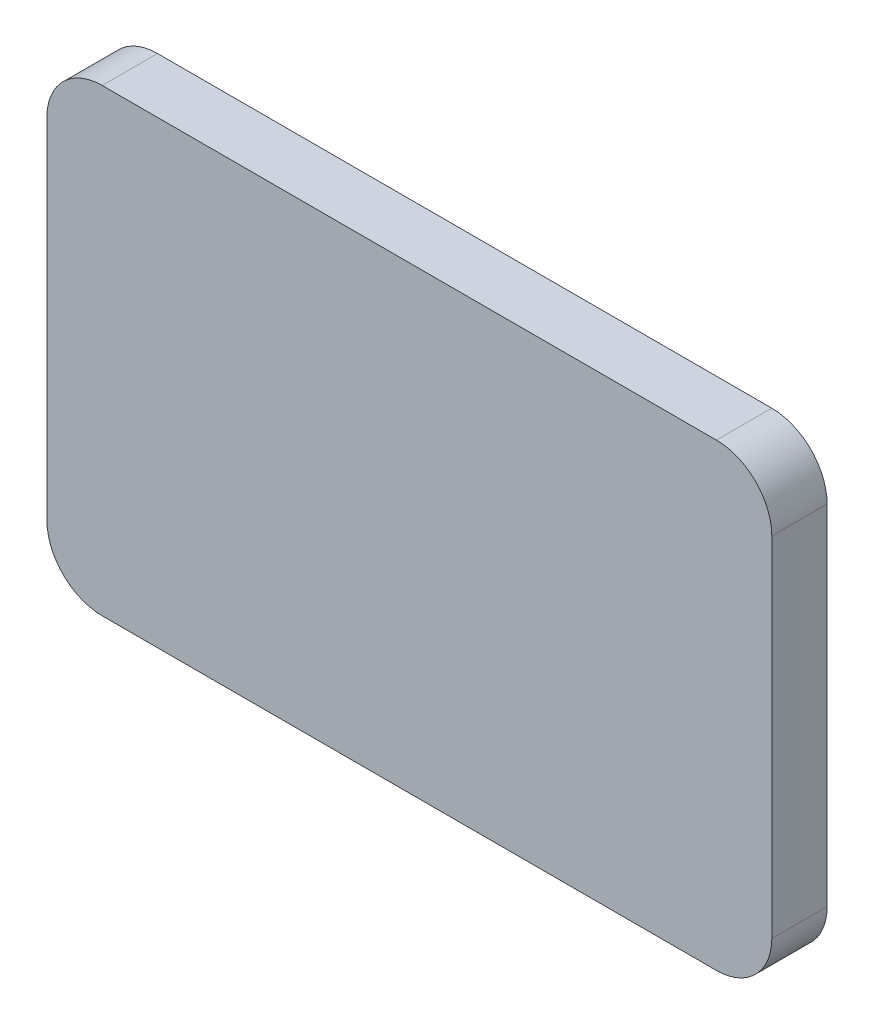
ISO-10303-21;
HEADER;
FILE_DESCRIPTION(('STEP AP214'),'2;1');
FILE_NAME('part.step','',(''),(''),'','','');
FILE_SCHEMA(('AUTOMOTIVE_DESIGN { 1 0 10303 214 1 1 1 1 }'));
ENDSEC;
DATA;
#1=APPLICATION_CONTEXT('core data for automotive mechanical design processes');
#2=APPLICATION_PROTOCOL_DEFINITION('international standard','automotive_design',2000,#1);
#3=PRODUCT_CONTEXT('',#1,'mechanical');
#4=PRODUCT('Part','Part','',(#3));
#5=PRODUCT_RELATED_PRODUCT_CATEGORY('part','',(#4));
#6=PRODUCT_DEFINITION_FORMATION('','',#4);
#7=PRODUCT_DEFINITION_CONTEXT('part definition',#1,'design');
#8=PRODUCT_DEFINITION('design','',#6,#7);
#9=PRODUCT_DEFINITION_SHAPE('','',#8);
#10=(LENGTH_UNIT() NAMED_UNIT(*) SI_UNIT(.MILLI.,.METRE.));
#11=(NAMED_UNIT(*) PLANE_ANGLE_UNIT() SI_UNIT($,.RADIAN.));
#12=(NAMED_UNIT(*) SI_UNIT($,.STERADIAN.) SOLID_ANGLE_UNIT());
#13=UNCERTAINTY_MEASURE_WITH_UNIT(LENGTH_MEASURE(1.E-05),#10,'distance_accuracy_value','');
#14=(GEOMETRIC_REPRESENTATION_CONTEXT(3) GLOBAL_UNCERTAINTY_ASSIGNED_CONTEXT((#13)) GLOBAL_UNIT_ASSIGNED_CONTEXT((#10,
#11,#12)) REPRESENTATION_CONTEXT('',''));
#15=CARTESIAN_POINT('',(0.,0.,0.));
#16=DIRECTION('',(0.,0.,1.));
#17=DIRECTION('',(1.,0.,0.));
#18=AXIS2_PLACEMENT_3D('',#15,#16,#17);
#19=CARTESIAN_POINT('',(32.75,20.75,5.));
#20=DIRECTION('',(-1.,0.,0.));
#21=DIRECTION('',(0.,-1.,0.));
#22=AXIS2_PLACEMENT_3D('',#19,#20,#21);
#23=PLANE('',#22);
#24=DIRECTION('',(0.,1.,0.));
#25=VECTOR('',#24,1.);
#26=CARTESIAN_POINT('',(32.75,20.75,5.));
#27=LINE('',#26,#25);
#28=CARTESIAN_POINT('',(32.75,-15.75,5.));
#29=VERTEX_POINT('',#28);
#30=CARTESIAN_POINT('',(32.75,15.75,5.));
#31=VERTEX_POINT('',#30);
#32=EDGE_CURVE('E174',#29,#31,#27,.T.);
#33=ORIENTED_EDGE('',*,*,#32,.F.);
#34=DIRECTION('',(0.,0.,-1.));
#35=VECTOR('',#34,1.);
#36=CARTESIAN_POINT('',(32.75,-15.75,5.));
#37=LINE('',#36,#35);
#38=CARTESIAN_POINT('',(32.75,-15.75,0.));
#39=VERTEX_POINT('',#38);
#40=EDGE_CURVE('E158',#29,#39,#37,.T.);
#41=ORIENTED_EDGE('',*,*,#40,.T.);
#42=DIRECTION('',(0.,1.,0.));
#43=VECTOR('',#42,1.);
#44=CARTESIAN_POINT('',(32.75,20.75,0.));
#45=LINE('',#44,#43);
#46=CARTESIAN_POINT('',(32.75,15.75,0.));
#47=VERTEX_POINT('',#46);
#48=EDGE_CURVE('E171',#39,#47,#45,.T.);
#49=ORIENTED_EDGE('',*,*,#48,.T.);
#50=DIRECTION('',(0.,0.,-1.));
#51=VECTOR('',#50,1.);
#52=CARTESIAN_POINT('',(32.75,15.75,5.));
#53=LINE('',#52,#51);
#54=EDGE_CURVE('E177',#47,#31,#53,.F.);
#55=ORIENTED_EDGE('',*,*,#54,.T.);
#56=EDGE_LOOP('',(#33,#41,#49,#55));
#57=FACE_BOUND('',#56,.T.);
#58=ADVANCED_FACE('F39',(#57),#23,.F.);
#59=CARTESIAN_POINT('',(-32.75,20.75,5.));
#60=DIRECTION('',(0.,-1.,0.));
#61=DIRECTION('',(0.,0.,-1.));
#62=AXIS2_PLACEMENT_3D('',#59,#60,#61);
#63=PLANE('',#62);
#64=DIRECTION('',(-1.,0.,0.));
#65=VECTOR('',#64,1.);
#66=CARTESIAN_POINT('',(-32.75,20.75,5.));
#67=LINE('',#66,#65);
#68=CARTESIAN_POINT('',(27.75,20.75,5.));
#69=VERTEX_POINT('',#68);
#70=CARTESIAN_POINT('',(-27.75,20.75,5.));
#71=VERTEX_POINT('',#70);
#72=EDGE_CURVE('E331',#69,#71,#67,.T.);
#73=ORIENTED_EDGE('',*,*,#72,.F.);
#74=DIRECTION('',(0.,0.,-1.));
#75=VECTOR('',#74,1.);
#76=CARTESIAN_POINT('',(27.75,20.75,5.));
#77=LINE('',#76,#75);
#78=CARTESIAN_POINT('',(27.75,20.75,0.));
#79=VERTEX_POINT('',#78);
#80=EDGE_CURVE('E232',#69,#79,#77,.T.);
#81=ORIENTED_EDGE('',*,*,#80,.T.);
#82=DIRECTION('',(-1.,0.,0.));
#83=VECTOR('',#82,1.);
#84=CARTESIAN_POINT('',(-32.75,20.75,0.));
#85=LINE('',#84,#83);
#86=CARTESIAN_POINT('',(-27.75,20.75,0.));
#87=VERTEX_POINT('',#86);
#88=EDGE_CURVE('E182',#79,#87,#85,.T.);
#89=ORIENTED_EDGE('',*,*,#88,.T.);
#90=DIRECTION('',(0.,0.,-1.));
#91=VECTOR('',#90,1.);
#92=CARTESIAN_POINT('',(-27.75,20.75,5.));
#93=LINE('',#92,#91);
#94=EDGE_CURVE('E229',#87,#71,#93,.F.);
#95=ORIENTED_EDGE('',*,*,#94,.T.);
#96=EDGE_LOOP('',(#73,#81,#89,#95));
#97=FACE_BOUND('',#96,.T.);
#98=ADVANCED_FACE('F360',(#97),#63,.F.);
#99=CARTESIAN_POINT('',(-32.75,20.75,5.));
#100=DIRECTION('',(1.,0.,0.));
#101=DIRECTION('',(0.,0.,-1.));
#102=AXIS2_PLACEMENT_3D('',#99,#100,#101);
#103=PLANE('',#102);
#104=DIRECTION('',(0.,-1.,0.));
#105=VECTOR('',#104,1.);
#106=CARTESIAN_POINT('',(-32.75,20.75,5.));
#107=LINE('',#106,#105);
#108=CARTESIAN_POINT('',(-32.75,15.75,5.));
#109=VERTEX_POINT('',#108);
#110=CARTESIAN_POINT('',(-32.75,-15.75,5.));
#111=VERTEX_POINT('',#110);
#112=EDGE_CURVE('E334',#109,#111,#107,.T.);
#113=ORIENTED_EDGE('',*,*,#112,.F.);
#114=DIRECTION('',(0.,0.,-1.));
#115=VECTOR('',#114,1.);
#116=CARTESIAN_POINT('',(-32.75,15.75,5.));
#117=LINE('',#116,#115);
#118=CARTESIAN_POINT('',(-32.75,15.75,0.));
#119=VERTEX_POINT('',#118);
#120=EDGE_CURVE('E239',#109,#119,#117,.T.);
#121=ORIENTED_EDGE('',*,*,#120,.T.);
#122=DIRECTION('',(0.,-1.,0.));
#123=VECTOR('',#122,1.);
#124=CARTESIAN_POINT('',(-32.75,20.75,0.));
#125=LINE('',#124,#123);
#126=CARTESIAN_POINT('',(-32.75,-15.75,0.));
#127=VERTEX_POINT('',#126);
#128=EDGE_CURVE('E188',#119,#127,#125,.T.);
#129=ORIENTED_EDGE('',*,*,#128,.T.);
#130=DIRECTION('',(0.,0.,-1.));
#131=VECTOR('',#130,1.);
#132=CARTESIAN_POINT('',(-32.75,-15.75,5.));
#133=LINE('',#132,#131);
#134=EDGE_CURVE('E236',#127,#111,#133,.F.);
#135=ORIENTED_EDGE('',*,*,#134,.T.);
#136=EDGE_LOOP('',(#113,#121,#129,#135));
#137=FACE_BOUND('',#136,.T.);
#138=ADVANCED_FACE('F352',(#137),#103,.F.);
#139=CARTESIAN_POINT('',(-32.75,-20.75,5.));
#140=DIRECTION('',(0.,1.,0.));
#141=DIRECTION('',(0.,0.,1.));
#142=AXIS2_PLACEMENT_3D('',#139,#140,#141);
#143=PLANE('',#142);
#144=DIRECTION('',(1.,0.,0.));
#145=VECTOR('',#144,1.);
#146=CARTESIAN_POINT('',(-32.75,-20.75,0.));
#147=LINE('',#146,#145);
#148=CARTESIAN_POINT('',(-27.75,-20.75,0.));
#149=VERTEX_POINT('',#148);
#150=CARTESIAN_POINT('',(27.75,-20.75,0.));
#151=VERTEX_POINT('',#150);
#152=EDGE_CURVE('E200',#149,#151,#147,.T.);
#153=ORIENTED_EDGE('',*,*,#152,.T.);
#154=DIRECTION('',(0.,0.,-1.));
#155=VECTOR('',#154,1.);
#156=CARTESIAN_POINT('',(27.75,-20.75,5.));
#157=LINE('',#156,#155);
#158=CARTESIAN_POINT('',(27.75,-20.75,5.));
#159=VERTEX_POINT('',#158);
#160=EDGE_CURVE('E159',#151,#159,#157,.F.);
#161=ORIENTED_EDGE('',*,*,#160,.T.);
#162=DIRECTION('',(1.,0.,0.));
#163=VECTOR('',#162,1.);
#164=CARTESIAN_POINT('',(-32.75,-20.75,5.));
#165=LINE('',#164,#163);
#166=CARTESIAN_POINT('',(-27.75,-20.75,5.));
#167=VERTEX_POINT('',#166);
#168=EDGE_CURVE('E194',#167,#159,#165,.T.);
#169=ORIENTED_EDGE('',*,*,#168,.F.);
#170=DIRECTION('',(0.,0.,-1.));
#171=VECTOR('',#170,1.);
#172=CARTESIAN_POINT('',(-27.75,-20.75,5.));
#173=LINE('',#172,#171);
#174=EDGE_CURVE('E165',#167,#149,#173,.T.);
#175=ORIENTED_EDGE('',*,*,#174,.T.);
#176=EDGE_LOOP('',(#153,#161,#169,#175));
#177=FACE_BOUND('',#176,.T.);
#178=ADVANCED_FACE('F346',(#177),#143,.F.);
#179=CARTESIAN_POINT('',(0.,0.,5.));
#180=DIRECTION('',(0.,0.,1.));
#181=DIRECTION('',(1.,0.,0.));
#182=AXIS2_PLACEMENT_3D('',#179,#180,#181);
#183=PLANE('',#182);
#184=ORIENTED_EDGE('',*,*,#168,.T.);
#185=CARTESIAN_POINT('',(27.75,-15.75,5.));
#186=DIRECTION('',(0.,0.,1.));
#187=DIRECTION('',(1.,0.,0.));
#188=AXIS2_PLACEMENT_3D('',#185,#186,#187);
#189=CIRCLE('',#188,5.);
#190=EDGE_CURVE('E226',#159,#29,#189,.T.);
#191=ORIENTED_EDGE('',*,*,#190,.T.);
#192=ORIENTED_EDGE('',*,*,#32,.T.);
#193=CARTESIAN_POINT('',(27.75,15.75,5.));
#194=DIRECTION('',(0.,0.,1.));
#195=DIRECTION('',(1.,0.,0.));
#196=AXIS2_PLACEMENT_3D('',#193,#194,#195);
#197=CIRCLE('',#196,5.);
#198=EDGE_CURVE('E223',#31,#69,#197,.T.);
#199=ORIENTED_EDGE('',*,*,#198,.T.);
#200=ORIENTED_EDGE('',*,*,#72,.T.);
#201=CARTESIAN_POINT('',(-27.75,15.75,5.));
#202=DIRECTION('',(0.,0.,1.));
#203=DIRECTION('',(1.,0.,0.));
#204=AXIS2_PLACEMENT_3D('',#201,#202,#203);
#205=CIRCLE('',#204,5.);
#206=EDGE_CURVE('E220',#71,#109,#205,.T.);
#207=ORIENTED_EDGE('',*,*,#206,.T.);
#208=ORIENTED_EDGE('',*,*,#112,.T.);
#209=CARTESIAN_POINT('',(-27.75,-15.75,5.));
#210=DIRECTION('',(0.,0.,1.));
#211=DIRECTION('',(1.,0.,0.));
#212=AXIS2_PLACEMENT_3D('',#209,#210,#211);
#213=CIRCLE('',#212,5.);
#214=EDGE_CURVE('E217',#111,#167,#213,.T.);
#215=ORIENTED_EDGE('',*,*,#214,.T.);
#216=EDGE_LOOP('',(#184,#191,#192,#199,#200,#207,#208,#215));
#217=FACE_BOUND('',#216,.T.);
#218=ADVANCED_FACE('F343',(#217),#183,.T.);
#219=CARTESIAN_POINT('',(0.,0.,0.));
#220=DIRECTION('',(0.,0.,1.));
#221=DIRECTION('',(1.,0.,0.));
#222=AXIS2_PLACEMENT_3D('',#219,#220,#221);
#223=PLANE('',#222);
#224=DIRECTION('',(0.,-1.,0.));
#225=VECTOR('',#224,1.);
#226=CARTESIAN_POINT('',(-29.75,20.75,0.));
#227=LINE('',#226,#225);
#228=CARTESIAN_POINT('',(-29.75,12.75,0.));
#229=VERTEX_POINT('',#228);
#230=CARTESIAN_POINT('',(-29.75,-12.75,0.));
#231=VERTEX_POINT('',#230);
#232=EDGE_CURVE('E299',#229,#231,#227,.T.);
#233=ORIENTED_EDGE('',*,*,#232,.T.);
#234=CARTESIAN_POINT('',(-24.75,-12.75,0.));
#235=DIRECTION('',(0.,0.,1.));
#236=DIRECTION('',(1.,0.,0.));
#237=AXIS2_PLACEMENT_3D('',#234,#235,#236);
#238=CIRCLE('',#237,5.);
#239=CARTESIAN_POINT('',(-24.75,-17.75,0.));
#240=VERTEX_POINT('',#239);
#241=EDGE_CURVE('E281',#231,#240,#238,.T.);
#242=ORIENTED_EDGE('',*,*,#241,.T.);
#243=DIRECTION('',(1.,0.,0.));
#244=VECTOR('',#243,1.);
#245=CARTESIAN_POINT('',(-32.75,-17.75,0.));
#246=LINE('',#245,#244);
#247=CARTESIAN_POINT('',(24.75,-17.75,0.));
#248=VERTEX_POINT('',#247);
#249=EDGE_CURVE('E314',#240,#248,#246,.T.);
#250=ORIENTED_EDGE('',*,*,#249,.T.);
#251=CARTESIAN_POINT('',(24.75,-12.75,0.));
#252=DIRECTION('',(0.,0.,1.));
#253=DIRECTION('',(1.,0.,0.));
#254=AXIS2_PLACEMENT_3D('',#251,#252,#253);
#255=CIRCLE('',#254,5.);
#256=CARTESIAN_POINT('',(29.75,-12.75,0.));
#257=VERTEX_POINT('',#256);
#258=EDGE_CURVE('E11',#248,#257,#255,.T.);
#259=ORIENTED_EDGE('',*,*,#258,.T.);
#260=DIRECTION('',(0.,1.,0.));
#261=VECTOR('',#260,1.);
#262=CARTESIAN_POINT('',(29.75,20.75,0.));
#263=LINE('',#262,#261);
#264=CARTESIAN_POINT('',(29.75,12.75,0.));
#265=VERTEX_POINT('',#264);
#266=EDGE_CURVE('E293',#257,#265,#263,.T.);
#267=ORIENTED_EDGE('',*,*,#266,.T.);
#268=CARTESIAN_POINT('',(24.75,12.75,0.));
#269=DIRECTION('',(0.,0.,1.));
#270=DIRECTION('',(1.,0.,0.));
#271=AXIS2_PLACEMENT_3D('',#268,#269,#270);
#272=CIRCLE('',#271,5.);
#273=CARTESIAN_POINT('',(24.75,17.75,0.));
#274=VERTEX_POINT('',#273);
#275=EDGE_CURVE('E48',#265,#274,#272,.T.);
#276=ORIENTED_EDGE('',*,*,#275,.T.);
#277=DIRECTION('',(-1.,0.,0.));
#278=VECTOR('',#277,1.);
#279=CARTESIAN_POINT('',(-32.75,17.75,0.));
#280=LINE('',#279,#278);
#281=CARTESIAN_POINT('',(-24.75,17.75,0.));
#282=VERTEX_POINT('',#281);
#283=EDGE_CURVE('E291',#274,#282,#280,.T.);
#284=ORIENTED_EDGE('',*,*,#283,.T.);
#285=CARTESIAN_POINT('',(-24.75,12.75,0.));
#286=DIRECTION('',(0.,0.,1.));
#287=DIRECTION('',(1.,0.,0.));
#288=AXIS2_PLACEMENT_3D('',#285,#286,#287);
#289=CIRCLE('',#288,5.);
#290=EDGE_CURVE('E284',#282,#229,#289,.T.);
#291=ORIENTED_EDGE('',*,*,#290,.T.);
#292=EDGE_LOOP('',(#233,#242,#250,#259,#267,#276,#284,#291));
#293=FACE_BOUND('',#292,.T.);
#294=ORIENTED_EDGE('',*,*,#48,.F.);
#295=CARTESIAN_POINT('',(27.75,-15.75,0.));
#296=DIRECTION('',(0.,0.,1.));
#297=DIRECTION('',(1.,0.,0.));
#298=AXIS2_PLACEMENT_3D('',#295,#296,#297);
#299=CIRCLE('',#298,5.);
#300=EDGE_CURVE('E154',#39,#151,#299,.F.);
#301=ORIENTED_EDGE('',*,*,#300,.T.);
#302=ORIENTED_EDGE('',*,*,#152,.F.);
#303=CARTESIAN_POINT('',(-27.75,-15.75,0.));
#304=DIRECTION('',(0.,0.,1.));
#305=DIRECTION('',(1.,0.,0.));
#306=AXIS2_PLACEMENT_3D('',#303,#304,#305);
#307=CIRCLE('',#306,5.);
#308=EDGE_CURVE('E176',#149,#127,#307,.F.);
#309=ORIENTED_EDGE('',*,*,#308,.T.);
#310=ORIENTED_EDGE('',*,*,#128,.F.);
#311=CARTESIAN_POINT('',(-27.75,15.75,0.));
#312=DIRECTION('',(0.,0.,1.));
#313=DIRECTION('',(1.,0.,0.));
#314=AXIS2_PLACEMENT_3D('',#311,#312,#313);
#315=CIRCLE('',#314,5.);
#316=EDGE_CURVE('E207',#119,#87,#315,.F.);
#317=ORIENTED_EDGE('',*,*,#316,.T.);
#318=ORIENTED_EDGE('',*,*,#88,.F.);
#319=CARTESIAN_POINT('',(27.75,15.75,0.));
#320=DIRECTION('',(0.,0.,1.));
#321=DIRECTION('',(1.,0.,0.));
#322=AXIS2_PLACEMENT_3D('',#319,#320,#321);
#323=CIRCLE('',#322,5.);
#324=EDGE_CURVE('E166',#79,#47,#323,.F.);
#325=ORIENTED_EDGE('',*,*,#324,.T.);
#326=EDGE_LOOP('',(#294,#301,#302,#309,#310,#317,#318,#325));
#327=FACE_BOUND('',#326,.T.);
#328=ADVANCED_FACE('F179',(#293,#327),#223,.F.);
#329=CARTESIAN_POINT('',(29.75,20.75,5.));
#330=DIRECTION('',(-1.,0.,0.));
#331=DIRECTION('',(0.,-1.,0.));
#332=AXIS2_PLACEMENT_3D('',#329,#330,#331);
#333=PLANE('',#332);
#334=DIRECTION('',(0.,1.,0.));
#335=VECTOR('',#334,1.);
#336=CARTESIAN_POINT('',(29.75,20.75,2.));
#337=LINE('',#336,#335);
#338=CARTESIAN_POINT('',(29.75,-12.75,2.));
#339=VERTEX_POINT('',#338);
#340=CARTESIAN_POINT('',(29.75,12.75,2.));
#341=VERTEX_POINT('',#340);
#342=EDGE_CURVE('E307',#339,#341,#337,.T.);
#343=ORIENTED_EDGE('',*,*,#342,.T.);
#344=DIRECTION('',(0.,0.,-1.));
#345=VECTOR('',#344,1.);
#346=CARTESIAN_POINT('',(29.75,12.75,0.));
#347=LINE('',#346,#345);
#348=EDGE_CURVE('E277',#341,#265,#347,.T.);
#349=ORIENTED_EDGE('',*,*,#348,.T.);
#350=ORIENTED_EDGE('',*,*,#266,.F.);
#351=DIRECTION('',(0.,0.,-1.));
#352=VECTOR('',#351,1.);
#353=CARTESIAN_POINT('',(29.75,-12.75,2.));
#354=LINE('',#353,#352);
#355=EDGE_CURVE('E274',#257,#339,#354,.F.);
#356=ORIENTED_EDGE('',*,*,#355,.T.);
#357=EDGE_LOOP('',(#343,#349,#350,#356));
#358=FACE_BOUND('',#357,.T.);
#359=ADVANCED_FACE('F311',(#358),#333,.T.);
#360=CARTESIAN_POINT('',(-32.75,17.75,5.));
#361=DIRECTION('',(0.,-1.,0.));
#362=DIRECTION('',(0.,0.,-1.));
#363=AXIS2_PLACEMENT_3D('',#360,#361,#362);
#364=PLANE('',#363);
#365=DIRECTION('',(-1.,0.,0.));
#366=VECTOR('',#365,1.);
#367=CARTESIAN_POINT('',(-32.75,17.75,2.));
#368=LINE('',#367,#366);
#369=CARTESIAN_POINT('',(24.75,17.75,2.));
#370=VERTEX_POINT('',#369);
#371=CARTESIAN_POINT('',(-24.75,17.75,2.));
#372=VERTEX_POINT('',#371);
#373=EDGE_CURVE('E309',#370,#372,#368,.T.);
#374=ORIENTED_EDGE('',*,*,#373,.T.);
#375=DIRECTION('',(0.,0.,-1.));
#376=VECTOR('',#375,1.);
#377=CARTESIAN_POINT('',(-24.75,17.75,0.));
#378=LINE('',#377,#376);
#379=EDGE_CURVE('E270',#372,#282,#378,.T.);
#380=ORIENTED_EDGE('',*,*,#379,.T.);
#381=ORIENTED_EDGE('',*,*,#283,.F.);
#382=DIRECTION('',(0.,0.,-1.));
#383=VECTOR('',#382,1.);
#384=CARTESIAN_POINT('',(24.75,17.75,2.));
#385=LINE('',#384,#383);
#386=EDGE_CURVE('E62',#274,#370,#385,.F.);
#387=ORIENTED_EDGE('',*,*,#386,.T.);
#388=EDGE_LOOP('',(#374,#380,#381,#387));
#389=FACE_BOUND('',#388,.T.);
#390=ADVANCED_FACE('F296',(#389),#364,.T.);
#391=CARTESIAN_POINT('',(-29.75,20.75,5.));
#392=DIRECTION('',(1.,0.,0.));
#393=DIRECTION('',(0.,0.,-1.));
#394=AXIS2_PLACEMENT_3D('',#391,#392,#393);
#395=PLANE('',#394);
#396=DIRECTION('',(0.,-1.,0.));
#397=VECTOR('',#396,1.);
#398=CARTESIAN_POINT('',(-29.75,20.75,2.));
#399=LINE('',#398,#397);
#400=CARTESIAN_POINT('',(-29.75,12.75,2.));
#401=VERTEX_POINT('',#400);
#402=CARTESIAN_POINT('',(-29.75,-12.75,2.));
#403=VERTEX_POINT('',#402);
#404=EDGE_CURVE('E191',#401,#403,#399,.T.);
#405=ORIENTED_EDGE('',*,*,#404,.T.);
#406=DIRECTION('',(0.,0.,-1.));
#407=VECTOR('',#406,1.);
#408=CARTESIAN_POINT('',(-29.75,-12.75,0.));
#409=LINE('',#408,#407);
#410=EDGE_CURVE('E246',#403,#231,#409,.T.);
#411=ORIENTED_EDGE('',*,*,#410,.T.);
#412=ORIENTED_EDGE('',*,*,#232,.F.);
#413=DIRECTION('',(0.,0.,-1.));
#414=VECTOR('',#413,1.);
#415=CARTESIAN_POINT('',(-29.75,12.75,2.));
#416=LINE('',#415,#414);
#417=EDGE_CURVE('E243',#229,#401,#416,.F.);
#418=ORIENTED_EDGE('',*,*,#417,.T.);
#419=EDGE_LOOP('',(#405,#411,#412,#418));
#420=FACE_BOUND('',#419,.T.);
#421=ADVANCED_FACE('F393',(#420),#395,.T.);
#422=CARTESIAN_POINT('',(-32.75,-17.75,5.));
#423=DIRECTION('',(0.,1.,0.));
#424=DIRECTION('',(0.,0.,1.));
#425=AXIS2_PLACEMENT_3D('',#422,#423,#424);
#426=PLANE('',#425);
#427=ORIENTED_EDGE('',*,*,#249,.F.);
#428=DIRECTION('',(0.,0.,-1.));
#429=VECTOR('',#428,1.);
#430=CARTESIAN_POINT('',(-24.75,-17.75,2.));
#431=LINE('',#430,#429);
#432=CARTESIAN_POINT('',(-24.75,-17.75,2.));
#433=VERTEX_POINT('',#432);
#434=EDGE_CURVE('E254',#240,#433,#431,.F.);
#435=ORIENTED_EDGE('',*,*,#434,.T.);
#436=DIRECTION('',(1.,0.,0.));
#437=VECTOR('',#436,1.);
#438=CARTESIAN_POINT('',(-32.75,-17.75,2.));
#439=LINE('',#438,#437);
#440=CARTESIAN_POINT('',(24.75,-17.75,2.));
#441=VERTEX_POINT('',#440);
#442=EDGE_CURVE('E183',#433,#441,#439,.T.);
#443=ORIENTED_EDGE('',*,*,#442,.T.);
#444=DIRECTION('',(0.,0.,-1.));
#445=VECTOR('',#444,1.);
#446=CARTESIAN_POINT('',(24.75,-17.75,0.));
#447=LINE('',#446,#445);
#448=EDGE_CURVE('E250',#441,#248,#447,.T.);
#449=ORIENTED_EDGE('',*,*,#448,.T.);
#450=EDGE_LOOP('',(#427,#435,#443,#449));
#451=FACE_BOUND('',#450,.T.);
#452=ADVANCED_FACE('F390',(#451),#426,.T.);
#453=CARTESIAN_POINT('',(0.,0.,2.));
#454=DIRECTION('',(0.,0.,1.));
#455=DIRECTION('',(1.,0.,0.));
#456=AXIS2_PLACEMENT_3D('',#453,#454,#455);
#457=PLANE('',#456);
#458=ORIENTED_EDGE('',*,*,#442,.F.);
#459=CARTESIAN_POINT('',(-24.75,-12.75,2.));
#460=DIRECTION('',(0.,0.,1.));
#461=DIRECTION('',(1.,0.,0.));
#462=AXIS2_PLACEMENT_3D('',#459,#460,#461);
#463=CIRCLE('',#462,5.);
#464=EDGE_CURVE('E265',#433,#403,#463,.F.);
#465=ORIENTED_EDGE('',*,*,#464,.T.);
#466=ORIENTED_EDGE('',*,*,#404,.F.);
#467=CARTESIAN_POINT('',(-24.75,12.75,2.));
#468=DIRECTION('',(0.,0.,1.));
#469=DIRECTION('',(1.,0.,0.));
#470=AXIS2_PLACEMENT_3D('',#467,#468,#469);
#471=CIRCLE('',#470,5.);
#472=EDGE_CURVE('E55',#401,#372,#471,.F.);
#473=ORIENTED_EDGE('',*,*,#472,.T.);
#474=ORIENTED_EDGE('',*,*,#373,.F.);
#475=CARTESIAN_POINT('',(24.75,12.75,2.));
#476=DIRECTION('',(0.,0.,1.));
#477=DIRECTION('',(1.,0.,0.));
#478=AXIS2_PLACEMENT_3D('',#475,#476,#477);
#479=CIRCLE('',#478,5.);
#480=EDGE_CURVE('E260',#370,#341,#479,.F.);
#481=ORIENTED_EDGE('',*,*,#480,.T.);
#482=ORIENTED_EDGE('',*,*,#342,.F.);
#483=CARTESIAN_POINT('',(24.75,-12.75,2.));
#484=DIRECTION('',(0.,0.,1.));
#485=DIRECTION('',(1.,0.,0.));
#486=AXIS2_PLACEMENT_3D('',#483,#484,#485);
#487=CIRCLE('',#486,5.);
#488=EDGE_CURVE('E257',#339,#441,#487,.F.);
#489=ORIENTED_EDGE('',*,*,#488,.T.);
#490=EDGE_LOOP('',(#458,#465,#466,#473,#474,#481,#482,#489));
#491=FACE_BOUND('',#490,.T.);
#492=ADVANCED_FACE('F306',(#491),#457,.F.);
#493=CARTESIAN_POINT('',(27.75,-15.75,5.));
#494=DIRECTION('',(0.,0.,-1.));
#495=DIRECTION('',(-1.,0.,0.));
#496=AXIS2_PLACEMENT_3D('',#493,#494,#495);
#497=CYLINDRICAL_SURFACE('',#496,5.);
#498=ORIENTED_EDGE('',*,*,#190,.F.);
#499=ORIENTED_EDGE('',*,*,#160,.F.);
#500=ORIENTED_EDGE('',*,*,#300,.F.);
#501=ORIENTED_EDGE('',*,*,#40,.F.);
#502=EDGE_LOOP('',(#498,#499,#500,#501));
#503=FACE_BOUND('',#502,.T.);
#504=ADVANCED_FACE('F157',(#503),#497,.T.);
#505=CARTESIAN_POINT('',(27.75,15.75,5.));
#506=DIRECTION('',(0.,0.,-1.));
#507=DIRECTION('',(-1.,0.,0.));
#508=AXIS2_PLACEMENT_3D('',#505,#506,#507);
#509=CYLINDRICAL_SURFACE('',#508,5.);
#510=ORIENTED_EDGE('',*,*,#198,.F.);
#511=ORIENTED_EDGE('',*,*,#54,.F.);
#512=ORIENTED_EDGE('',*,*,#324,.F.);
#513=ORIENTED_EDGE('',*,*,#80,.F.);
#514=EDGE_LOOP('',(#510,#511,#512,#513));
#515=FACE_BOUND('',#514,.T.);
#516=ADVANCED_FACE('F364',(#515),#509,.T.);
#517=CARTESIAN_POINT('',(-27.75,15.75,5.));
#518=DIRECTION('',(0.,0.,-1.));
#519=DIRECTION('',(-1.,0.,0.));
#520=AXIS2_PLACEMENT_3D('',#517,#518,#519);
#521=CYLINDRICAL_SURFACE('',#520,5.);
#522=ORIENTED_EDGE('',*,*,#206,.F.);
#523=ORIENTED_EDGE('',*,*,#94,.F.);
#524=ORIENTED_EDGE('',*,*,#316,.F.);
#525=ORIENTED_EDGE('',*,*,#120,.F.);
#526=EDGE_LOOP('',(#522,#523,#524,#525));
#527=FACE_BOUND('',#526,.T.);
#528=ADVANCED_FACE('F356',(#527),#521,.T.);
#529=CARTESIAN_POINT('',(-27.75,-15.75,5.));
#530=DIRECTION('',(0.,0.,-1.));
#531=DIRECTION('',(-1.,0.,0.));
#532=AXIS2_PLACEMENT_3D('',#529,#530,#531);
#533=CYLINDRICAL_SURFACE('',#532,5.);
#534=ORIENTED_EDGE('',*,*,#214,.F.);
#535=ORIENTED_EDGE('',*,*,#134,.F.);
#536=ORIENTED_EDGE('',*,*,#308,.F.);
#537=ORIENTED_EDGE('',*,*,#174,.F.);
#538=EDGE_LOOP('',(#534,#535,#536,#537));
#539=FACE_BOUND('',#538,.T.);
#540=ADVANCED_FACE('F348',(#539),#533,.T.);
#541=CARTESIAN_POINT('',(-24.75,-12.75,5.));
#542=DIRECTION('',(0.,0.,1.));
#543=DIRECTION('',(1.,0.,0.));
#544=AXIS2_PLACEMENT_3D('',#541,#542,#543);
#545=CYLINDRICAL_SURFACE('',#544,5.);
#546=ORIENTED_EDGE('',*,*,#464,.F.);
#547=ORIENTED_EDGE('',*,*,#434,.F.);
#548=ORIENTED_EDGE('',*,*,#241,.F.);
#549=ORIENTED_EDGE('',*,*,#410,.F.);
#550=EDGE_LOOP('',(#546,#547,#548,#549));
#551=FACE_BOUND('',#550,.T.);
#552=ADVANCED_FACE('F444',(#551),#545,.F.);
#553=CARTESIAN_POINT('',(-24.75,12.75,5.));
#554=DIRECTION('',(0.,0.,1.));
#555=DIRECTION('',(1.,0.,0.));
#556=AXIS2_PLACEMENT_3D('',#553,#554,#555);
#557=CYLINDRICAL_SURFACE('',#556,5.);
#558=ORIENTED_EDGE('',*,*,#472,.F.);
#559=ORIENTED_EDGE('',*,*,#417,.F.);
#560=ORIENTED_EDGE('',*,*,#290,.F.);
#561=ORIENTED_EDGE('',*,*,#379,.F.);
#562=EDGE_LOOP('',(#558,#559,#560,#561));
#563=FACE_BOUND('',#562,.T.);
#564=ADVANCED_FACE('F453',(#563),#557,.F.);
#565=CARTESIAN_POINT('',(24.75,12.75,5.));
#566=DIRECTION('',(0.,0.,1.));
#567=DIRECTION('',(1.,0.,0.));
#568=AXIS2_PLACEMENT_3D('',#565,#566,#567);
#569=CYLINDRICAL_SURFACE('',#568,5.);
#570=ORIENTED_EDGE('',*,*,#480,.F.);
#571=ORIENTED_EDGE('',*,*,#386,.F.);
#572=ORIENTED_EDGE('',*,*,#275,.F.);
#573=ORIENTED_EDGE('',*,*,#348,.F.);
#574=EDGE_LOOP('',(#570,#571,#572,#573));
#575=FACE_BOUND('',#574,.T.);
#576=ADVANCED_FACE('F302',(#575),#569,.F.);
#577=CARTESIAN_POINT('',(24.75,-12.75,5.));
#578=DIRECTION('',(0.,0.,1.));
#579=DIRECTION('',(1.,0.,0.));
#580=AXIS2_PLACEMENT_3D('',#577,#578,#579);
#581=CYLINDRICAL_SURFACE('',#580,5.);
#582=ORIENTED_EDGE('',*,*,#488,.F.);
#583=ORIENTED_EDGE('',*,*,#355,.F.);
#584=ORIENTED_EDGE('',*,*,#258,.F.);
#585=ORIENTED_EDGE('',*,*,#448,.F.);
#586=EDGE_LOOP('',(#582,#583,#584,#585));
#587=FACE_BOUND('',#586,.T.);
#588=ADVANCED_FACE('F41',(#587),#581,.F.);
#589=CLOSED_SHELL('',(#58,#98,#138,#178,#218,#328,#359,#390,#421,#452,#492,#504,#516,#528,#540,
#552,#564,#576,#588));
#590=MANIFOLD_SOLID_BREP('B2',#589);
#591=ADVANCED_BREP_SHAPE_REPRESENTATION('',(#18,#590),#14);
#592=SHAPE_DEFINITION_REPRESENTATION(#9,#591);
ENDSEC;
END-ISO-10303-21;
